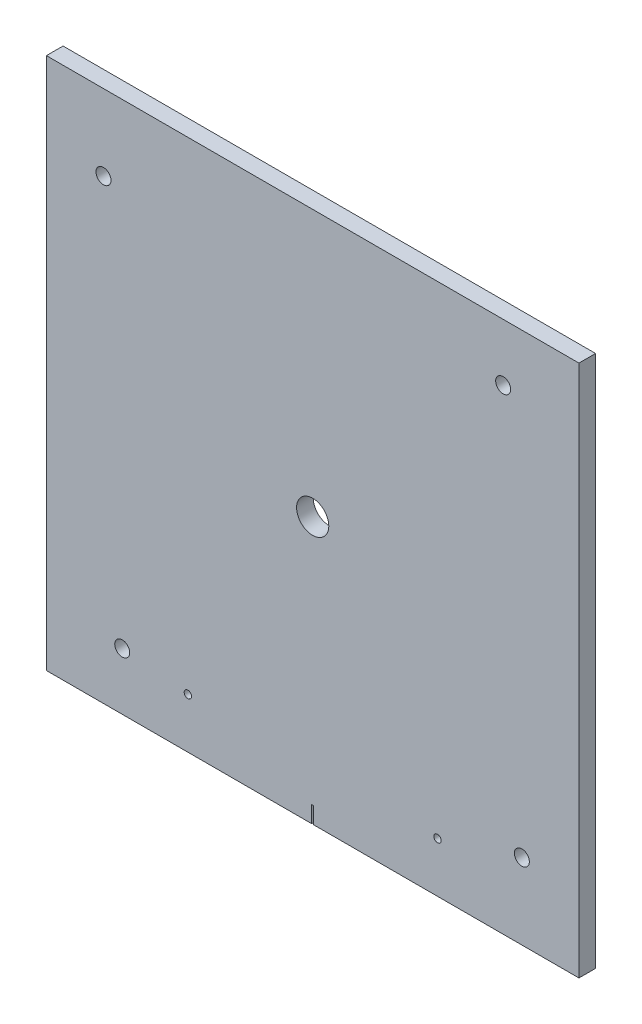
ISO-10303-21;
HEADER;
FILE_DESCRIPTION(('STEP AP214'),'2;1');
FILE_NAME('part.step','',(''),(''),'','','');
FILE_SCHEMA(('AUTOMOTIVE_DESIGN { 1 0 10303 214 1 1 1 1 }'));
ENDSEC;
DATA;
#1=APPLICATION_CONTEXT('core data for automotive mechanical design processes');
#2=APPLICATION_PROTOCOL_DEFINITION('international standard','automotive_design',2000,#1);
#3=PRODUCT_CONTEXT('',#1,'mechanical');
#4=PRODUCT('Part','Part','',(#3));
#5=PRODUCT_RELATED_PRODUCT_CATEGORY('part','',(#4));
#6=PRODUCT_DEFINITION_FORMATION('','',#4);
#7=PRODUCT_DEFINITION_CONTEXT('part definition',#1,'design');
#8=PRODUCT_DEFINITION('design','',#6,#7);
#9=PRODUCT_DEFINITION_SHAPE('','',#8);
#10=(LENGTH_UNIT() NAMED_UNIT(*) SI_UNIT(.MILLI.,.METRE.));
#11=(NAMED_UNIT(*) PLANE_ANGLE_UNIT() SI_UNIT($,.RADIAN.));
#12=(NAMED_UNIT(*) SI_UNIT($,.STERADIAN.) SOLID_ANGLE_UNIT());
#13=UNCERTAINTY_MEASURE_WITH_UNIT(LENGTH_MEASURE(1.E-05),#10,'distance_accuracy_value','');
#14=(GEOMETRIC_REPRESENTATION_CONTEXT(3) GLOBAL_UNCERTAINTY_ASSIGNED_CONTEXT((#13)) GLOBAL_UNIT_ASSIGNED_CONTEXT((#10,
#11,#12)) REPRESENTATION_CONTEXT('',''));
#15=CARTESIAN_POINT('',(0.,0.,0.));
#16=DIRECTION('',(0.,0.,1.));
#17=DIRECTION('',(1.,0.,0.));
#18=AXIS2_PLACEMENT_3D('',#15,#16,#17);
#19=CARTESIAN_POINT('',(-101.6,-101.6,6.35));
#20=DIRECTION('',(0.,1.,0.));
#21=DIRECTION('',(0.,0.,1.));
#22=AXIS2_PLACEMENT_3D('',#19,#20,#21);
#23=PLANE('',#22);
#24=DIRECTION('',(1.,0.,0.));
#25=VECTOR('',#24,1.);
#26=CARTESIAN_POINT('',(-101.6,-101.6,0.));
#27=LINE('',#26,#25);
#28=CARTESIAN_POINT('',(-101.6,-101.6,0.));
#29=VERTEX_POINT('',#28);
#30=CARTESIAN_POINT('',(-0.396875,-101.6,0.));
#31=VERTEX_POINT('',#30);
#32=EDGE_CURVE('E117',#29,#31,#27,.T.);
#33=ORIENTED_EDGE('',*,*,#32,.T.);
#34=DIRECTION('',(0.,0.,1.));
#35=VECTOR('',#34,1.);
#36=CARTESIAN_POINT('',(-0.396875,-101.6,0.));
#37=LINE('',#36,#35);
#38=CARTESIAN_POINT('',(-0.396875,-101.6,6.35));
#39=VERTEX_POINT('',#38);
#40=EDGE_CURVE('E105',#31,#39,#37,.T.);
#41=ORIENTED_EDGE('',*,*,#40,.T.);
#42=DIRECTION('',(1.,0.,0.));
#43=VECTOR('',#42,1.);
#44=CARTESIAN_POINT('',(-101.6,-101.6,6.35));
#45=LINE('',#44,#43);
#46=CARTESIAN_POINT('',(-101.6,-101.6,6.35));
#47=VERTEX_POINT('',#46);
#48=EDGE_CURVE('E83',#47,#39,#45,.T.);
#49=ORIENTED_EDGE('',*,*,#48,.F.);
#50=DIRECTION('',(0.,0.,-1.));
#51=VECTOR('',#50,1.);
#52=CARTESIAN_POINT('',(-101.6,-101.6,6.35));
#53=LINE('',#52,#51);
#54=EDGE_CURVE('E11',#47,#29,#53,.T.);
#55=ORIENTED_EDGE('',*,*,#54,.T.);
#56=EDGE_LOOP('',(#33,#41,#49,#55));
#57=FACE_BOUND('',#56,.T.);
#58=ADVANCED_FACE('F31',(#57),#23,.F.);
#59=CARTESIAN_POINT('',(-101.6,101.6,6.35));
#60=DIRECTION('',(1.,0.,0.));
#61=DIRECTION('',(0.,1.,0.));
#62=AXIS2_PLACEMENT_3D('',#59,#60,#61);
#63=PLANE('',#62);
#64=DIRECTION('',(0.,-1.,0.));
#65=VECTOR('',#64,1.);
#66=CARTESIAN_POINT('',(-101.6,101.6,0.));
#67=LINE('',#66,#65);
#68=CARTESIAN_POINT('',(-101.6,101.6,0.));
#69=VERTEX_POINT('',#68);
#70=EDGE_CURVE('E128',#69,#29,#67,.T.);
#71=ORIENTED_EDGE('',*,*,#70,.T.);
#72=ORIENTED_EDGE('',*,*,#54,.F.);
#73=DIRECTION('',(0.,-1.,0.));
#74=VECTOR('',#73,1.);
#75=CARTESIAN_POINT('',(-101.6,101.6,6.35));
#76=LINE('',#75,#74);
#77=CARTESIAN_POINT('',(-101.6,101.6,6.35));
#78=VERTEX_POINT('',#77);
#79=EDGE_CURVE('E133',#78,#47,#76,.T.);
#80=ORIENTED_EDGE('',*,*,#79,.F.);
#81=DIRECTION('',(0.,0.,-1.));
#82=VECTOR('',#81,1.);
#83=CARTESIAN_POINT('',(-101.6,101.6,6.35));
#84=LINE('',#83,#82);
#85=EDGE_CURVE('E134',#78,#69,#84,.T.);
#86=ORIENTED_EDGE('',*,*,#85,.T.);
#87=EDGE_LOOP('',(#71,#72,#80,#86));
#88=FACE_BOUND('',#87,.T.);
#89=ADVANCED_FACE('F33',(#88),#63,.F.);
#90=CARTESIAN_POINT('',(0.396875,-101.6,6.35));
#91=VERTEX_POINT('',#90);
#92=CARTESIAN_POINT('',(101.6,-101.6,6.35));
#93=VERTEX_POINT('',#92);
#94=EDGE_CURVE('E163',#91,#93,#45,.T.);
#95=ORIENTED_EDGE('',*,*,#94,.F.);
#96=DIRECTION('',(0.,0.,1.));
#97=VECTOR('',#96,1.);
#98=CARTESIAN_POINT('',(0.396875,-101.6,0.));
#99=LINE('',#98,#97);
#100=CARTESIAN_POINT('',(0.396875,-101.6,0.));
#101=VERTEX_POINT('',#100);
#102=EDGE_CURVE('E112',#101,#91,#99,.T.);
#103=ORIENTED_EDGE('',*,*,#102,.F.);
#104=CARTESIAN_POINT('',(101.6,-101.6,0.));
#105=VERTEX_POINT('',#104);
#106=EDGE_CURVE('E125',#101,#105,#27,.T.);
#107=ORIENTED_EDGE('',*,*,#106,.T.);
#108=DIRECTION('',(0.,0.,-1.));
#109=VECTOR('',#108,1.);
#110=CARTESIAN_POINT('',(101.6,-101.6,6.35));
#111=LINE('',#110,#109);
#112=EDGE_CURVE('E39',#93,#105,#111,.T.);
#113=ORIENTED_EDGE('',*,*,#112,.F.);
#114=EDGE_LOOP('',(#95,#103,#107,#113));
#115=FACE_BOUND('',#114,.T.);
#116=ADVANCED_FACE('F222',(#115),#23,.F.);
#117=CARTESIAN_POINT('',(101.6,101.6,6.35));
#118=DIRECTION('',(-1.,0.,0.));
#119=DIRECTION('',(0.,-1.,0.));
#120=AXIS2_PLACEMENT_3D('',#117,#118,#119);
#121=PLANE('',#120);
#122=DIRECTION('',(0.,1.,0.));
#123=VECTOR('',#122,1.);
#124=CARTESIAN_POINT('',(101.6,101.6,0.));
#125=LINE('',#124,#123);
#126=CARTESIAN_POINT('',(101.6,101.6,0.));
#127=VERTEX_POINT('',#126);
#128=EDGE_CURVE('E124',#105,#127,#125,.T.);
#129=ORIENTED_EDGE('',*,*,#128,.T.);
#130=DIRECTION('',(0.,0.,-1.));
#131=VECTOR('',#130,1.);
#132=CARTESIAN_POINT('',(101.6,101.6,6.35));
#133=LINE('',#132,#131);
#134=CARTESIAN_POINT('',(101.6,101.6,6.35));
#135=VERTEX_POINT('',#134);
#136=EDGE_CURVE('E136',#135,#127,#133,.T.);
#137=ORIENTED_EDGE('',*,*,#136,.F.);
#138=DIRECTION('',(0.,1.,0.));
#139=VECTOR('',#138,1.);
#140=CARTESIAN_POINT('',(101.6,101.6,6.35));
#141=LINE('',#140,#139);
#142=EDGE_CURVE('E144',#93,#135,#141,.T.);
#143=ORIENTED_EDGE('',*,*,#142,.F.);
#144=ORIENTED_EDGE('',*,*,#112,.T.);
#145=EDGE_LOOP('',(#129,#137,#143,#144));
#146=FACE_BOUND('',#145,.T.);
#147=ADVANCED_FACE('F142',(#146),#121,.F.);
#148=CARTESIAN_POINT('',(-101.6,101.6,6.35));
#149=DIRECTION('',(0.,-1.,0.));
#150=DIRECTION('',(0.,0.,-1.));
#151=AXIS2_PLACEMENT_3D('',#148,#149,#150);
#152=PLANE('',#151);
#153=DIRECTION('',(-1.,0.,0.));
#154=VECTOR('',#153,1.);
#155=CARTESIAN_POINT('',(-101.6,101.6,0.));
#156=LINE('',#155,#154);
#157=EDGE_CURVE('E76',#127,#69,#156,.T.);
#158=ORIENTED_EDGE('',*,*,#157,.T.);
#159=ORIENTED_EDGE('',*,*,#85,.F.);
#160=DIRECTION('',(-1.,0.,0.));
#161=VECTOR('',#160,1.);
#162=CARTESIAN_POINT('',(-101.6,101.6,6.35));
#163=LINE('',#162,#161);
#164=EDGE_CURVE('E55',#135,#78,#163,.T.);
#165=ORIENTED_EDGE('',*,*,#164,.F.);
#166=ORIENTED_EDGE('',*,*,#136,.T.);
#167=EDGE_LOOP('',(#158,#159,#165,#166));
#168=FACE_BOUND('',#167,.T.);
#169=ADVANCED_FACE('F168',(#168),#152,.F.);
#170=CARTESIAN_POINT('',(-101.6,-101.6,6.35));
#171=DIRECTION('',(0.,0.,1.));
#172=DIRECTION('',(1.,0.,0.));
#173=AXIS2_PLACEMENT_3D('',#170,#171,#172);
#174=PLANE('',#173);
#175=CARTESIAN_POINT('',(79.8229388799338,-72.6739356892851,6.35));
#176=DIRECTION('',(0.,0.,1.));
#177=DIRECTION('',(1.,0.,0.));
#178=AXIS2_PLACEMENT_3D('',#175,#176,#177);
#179=CIRCLE('',#178,2.8575);
#180=CARTESIAN_POINT('',(82.6804388799338,-72.6739356892851,6.35));
#181=VERTEX_POINT('',#180);
#182=EDGE_CURVE('E250',#181,#181,#179,.T.);
#183=ORIENTED_EDGE('',*,*,#182,.F.);
#184=EDGE_LOOP('',(#183));
#185=FACE_BOUND('',#184,.T.);
#186=CARTESIAN_POINT('',(-72.6739356892852,-79.8229388799338,6.35));
#187=DIRECTION('',(0.,0.,1.));
#188=DIRECTION('',(1.,0.,0.));
#189=AXIS2_PLACEMENT_3D('',#186,#187,#188);
#190=CIRCLE('',#189,2.8575);
#191=CARTESIAN_POINT('',(-69.8164356892852,-79.8229388799338,6.35));
#192=VERTEX_POINT('',#191);
#193=EDGE_CURVE('E244',#192,#192,#190,.T.);
#194=ORIENTED_EDGE('',*,*,#193,.F.);
#195=EDGE_LOOP('',(#194));
#196=FACE_BOUND('',#195,.T.);
#197=CARTESIAN_POINT('',(72.6739356892855,79.8229388799335,6.35));
#198=DIRECTION('',(0.,0.,1.));
#199=DIRECTION('',(1.,0.,0.));
#200=AXIS2_PLACEMENT_3D('',#197,#198,#199);
#201=CIRCLE('',#200,2.8575);
#202=CARTESIAN_POINT('',(75.5314356892855,79.8229388799335,6.35));
#203=VERTEX_POINT('',#202);
#204=EDGE_CURVE('E238',#203,#203,#201,.T.);
#205=ORIENTED_EDGE('',*,*,#204,.F.);
#206=EDGE_LOOP('',(#205));
#207=FACE_BOUND('',#206,.T.);
#208=CARTESIAN_POINT('',(-79.8229388799337,72.6739356892852,6.35));
#209=DIRECTION('',(0.,0.,1.));
#210=DIRECTION('',(1.,0.,0.));
#211=AXIS2_PLACEMENT_3D('',#208,#209,#210);
#212=CIRCLE('',#211,2.8575);
#213=CARTESIAN_POINT('',(-76.9654388799337,72.6739356892852,6.35));
#214=VERTEX_POINT('',#213);
#215=EDGE_CURVE('E178',#214,#214,#212,.T.);
#216=ORIENTED_EDGE('',*,*,#215,.F.);
#217=EDGE_LOOP('',(#216));
#218=FACE_BOUND('',#217,.T.);
#219=DIRECTION('',(0.,-1.,0.));
#220=VECTOR('',#219,1.);
#221=CARTESIAN_POINT('',(-0.396875,-95.25,6.35));
#222=LINE('',#221,#220);
#223=CARTESIAN_POINT('',(-0.396875,-95.25,6.35));
#224=VERTEX_POINT('',#223);
#225=EDGE_CURVE('E110',#224,#39,#222,.T.);
#226=ORIENTED_EDGE('',*,*,#225,.F.);
#227=DIRECTION('',(-1.,0.,0.));
#228=VECTOR('',#227,1.);
#229=CARTESIAN_POINT('',(-0.396875,-95.25,6.35));
#230=LINE('',#229,#228);
#231=CARTESIAN_POINT('',(0.396875,-95.25,6.35));
#232=VERTEX_POINT('',#231);
#233=EDGE_CURVE('E120',#232,#224,#230,.T.);
#234=ORIENTED_EDGE('',*,*,#233,.F.);
#235=DIRECTION('',(0.,1.,0.));
#236=VECTOR('',#235,1.);
#237=CARTESIAN_POINT('',(0.396875,-101.6,6.35));
#238=LINE('',#237,#236);
#239=EDGE_CURVE('E172',#91,#232,#238,.T.);
#240=ORIENTED_EDGE('',*,*,#239,.F.);
#241=ORIENTED_EDGE('',*,*,#94,.T.);
#242=ORIENTED_EDGE('',*,*,#142,.T.);
#243=ORIENTED_EDGE('',*,*,#164,.T.);
#244=ORIENTED_EDGE('',*,*,#79,.T.);
#245=ORIENTED_EDGE('',*,*,#48,.T.);
#246=EDGE_LOOP('',(#226,#234,#240,#241,#242,#243,#244,#245));
#247=FACE_BOUND('',#246,.T.);
#248=CARTESIAN_POINT('',(47.6250000000002,-82.4889197104677,6.35));
#249=DIRECTION('',(0.,0.,1.));
#250=DIRECTION('',(1.,0.,0.));
#251=AXIS2_PLACEMENT_3D('',#248,#249,#250);
#252=CIRCLE('',#251,1.4097);
#253=CARTESIAN_POINT('',(49.0347000000002,-82.4889197104677,6.35));
#254=VERTEX_POINT('',#253);
#255=EDGE_CURVE('E186',#254,#254,#252,.T.);
#256=ORIENTED_EDGE('',*,*,#255,.F.);
#257=EDGE_LOOP('',(#256));
#258=FACE_BOUND('',#257,.T.);
#259=CARTESIAN_POINT('',(-47.625,-82.4889197104678,6.35));
#260=DIRECTION('',(0.,0.,1.));
#261=DIRECTION('',(1.,0.,0.));
#262=AXIS2_PLACEMENT_3D('',#259,#260,#261);
#263=CIRCLE('',#262,1.4097);
#264=CARTESIAN_POINT('',(-46.2153,-82.4889197104678,6.35));
#265=VERTEX_POINT('',#264);
#266=EDGE_CURVE('E159',#265,#265,#263,.T.);
#267=ORIENTED_EDGE('',*,*,#266,.F.);
#268=EDGE_LOOP('',(#267));
#269=FACE_BOUND('',#268,.T.);
#270=CARTESIAN_POINT('',(0.,0.,6.35));
#271=DIRECTION('',(0.,0.,1.));
#272=DIRECTION('',(1.,0.,0.));
#273=AXIS2_PLACEMENT_3D('',#270,#271,#272);
#274=CIRCLE('',#273,6.1468);
#275=CARTESIAN_POINT('',(6.1468,0.,6.35));
#276=VERTEX_POINT('',#275);
#277=EDGE_CURVE('E151',#276,#276,#274,.T.);
#278=ORIENTED_EDGE('',*,*,#277,.F.);
#279=EDGE_LOOP('',(#278));
#280=FACE_BOUND('',#279,.T.);
#281=ADVANCED_FACE('F165',(#185,#196,#207,#218,#247,#258,#269,#280),#174,.T.);
#282=CARTESIAN_POINT('',(-101.6,-101.6,0.));
#283=DIRECTION('',(0.,0.,1.));
#284=DIRECTION('',(1.,0.,0.));
#285=AXIS2_PLACEMENT_3D('',#282,#283,#284);
#286=PLANE('',#285);
#287=CARTESIAN_POINT('',(79.8229388799338,-72.6739356892851,0.));
#288=DIRECTION('',(0.,0.,1.));
#289=DIRECTION('',(1.,0.,0.));
#290=AXIS2_PLACEMENT_3D('',#287,#288,#289);
#291=CIRCLE('',#290,2.8575);
#292=CARTESIAN_POINT('',(82.6804388799338,-72.6739356892851,0.));
#293=VERTEX_POINT('',#292);
#294=EDGE_CURVE('E247',#293,#293,#291,.T.);
#295=ORIENTED_EDGE('',*,*,#294,.T.);
#296=EDGE_LOOP('',(#295));
#297=FACE_BOUND('',#296,.T.);
#298=CARTESIAN_POINT('',(-72.6739356892852,-79.8229388799338,0.));
#299=DIRECTION('',(0.,0.,1.));
#300=DIRECTION('',(1.,0.,0.));
#301=AXIS2_PLACEMENT_3D('',#298,#299,#300);
#302=CIRCLE('',#301,2.8575);
#303=CARTESIAN_POINT('',(-69.8164356892852,-79.8229388799338,0.));
#304=VERTEX_POINT('',#303);
#305=EDGE_CURVE('E241',#304,#304,#302,.T.);
#306=ORIENTED_EDGE('',*,*,#305,.T.);
#307=EDGE_LOOP('',(#306));
#308=FACE_BOUND('',#307,.T.);
#309=CARTESIAN_POINT('',(72.6739356892855,79.8229388799335,0.));
#310=DIRECTION('',(0.,0.,1.));
#311=DIRECTION('',(1.,0.,0.));
#312=AXIS2_PLACEMENT_3D('',#309,#310,#311);
#313=CIRCLE('',#312,2.8575);
#314=CARTESIAN_POINT('',(75.5314356892855,79.8229388799335,0.));
#315=VERTEX_POINT('',#314);
#316=EDGE_CURVE('E236',#315,#315,#313,.T.);
#317=ORIENTED_EDGE('',*,*,#316,.T.);
#318=EDGE_LOOP('',(#317));
#319=FACE_BOUND('',#318,.T.);
#320=CARTESIAN_POINT('',(-79.8229388799337,72.6739356892852,0.));
#321=DIRECTION('',(0.,0.,1.));
#322=DIRECTION('',(1.,0.,0.));
#323=AXIS2_PLACEMENT_3D('',#320,#321,#322);
#324=CIRCLE('',#323,2.8575);
#325=CARTESIAN_POINT('',(-76.9654388799337,72.6739356892852,0.));
#326=VERTEX_POINT('',#325);
#327=EDGE_CURVE('E173',#326,#326,#324,.T.);
#328=ORIENTED_EDGE('',*,*,#327,.T.);
#329=EDGE_LOOP('',(#328));
#330=FACE_BOUND('',#329,.T.);
#331=CARTESIAN_POINT('',(47.6250000000002,-82.4889197104677,0.));
#332=DIRECTION('',(0.,0.,1.));
#333=DIRECTION('',(1.,0.,0.));
#334=AXIS2_PLACEMENT_3D('',#331,#332,#333);
#335=CIRCLE('',#334,1.4097);
#336=CARTESIAN_POINT('',(49.0347000000002,-82.4889197104677,0.));
#337=VERTEX_POINT('',#336);
#338=EDGE_CURVE('E190',#337,#337,#335,.T.);
#339=ORIENTED_EDGE('',*,*,#338,.T.);
#340=EDGE_LOOP('',(#339));
#341=FACE_BOUND('',#340,.T.);
#342=CARTESIAN_POINT('',(-47.625,-82.4889197104678,0.));
#343=DIRECTION('',(0.,0.,1.));
#344=DIRECTION('',(1.,0.,0.));
#345=AXIS2_PLACEMENT_3D('',#342,#343,#344);
#346=CIRCLE('',#345,1.4097);
#347=CARTESIAN_POINT('',(-46.2153,-82.4889197104678,0.));
#348=VERTEX_POINT('',#347);
#349=EDGE_CURVE('E156',#348,#348,#346,.T.);
#350=ORIENTED_EDGE('',*,*,#349,.T.);
#351=EDGE_LOOP('',(#350));
#352=FACE_BOUND('',#351,.T.);
#353=CARTESIAN_POINT('',(0.,0.,0.));
#354=DIRECTION('',(0.,0.,1.));
#355=DIRECTION('',(1.,0.,0.));
#356=AXIS2_PLACEMENT_3D('',#353,#354,#355);
#357=CIRCLE('',#356,6.1468);
#358=CARTESIAN_POINT('',(6.1468,0.,0.));
#359=VERTEX_POINT('',#358);
#360=EDGE_CURVE('E149',#359,#359,#357,.T.);
#361=ORIENTED_EDGE('',*,*,#360,.T.);
#362=EDGE_LOOP('',(#361));
#363=FACE_BOUND('',#362,.T.);
#364=DIRECTION('',(-1.,0.,0.));
#365=VECTOR('',#364,1.);
#366=CARTESIAN_POINT('',(-0.396875,-95.25,0.));
#367=LINE('',#366,#365);
#368=CARTESIAN_POINT('',(0.396875000000005,-95.25,0.));
#369=VERTEX_POINT('',#368);
#370=CARTESIAN_POINT('',(-0.396875,-95.25,0.));
#371=VERTEX_POINT('',#370);
#372=EDGE_CURVE('E46',#369,#371,#367,.T.);
#373=ORIENTED_EDGE('',*,*,#372,.T.);
#374=DIRECTION('',(0.,-1.,0.));
#375=VECTOR('',#374,1.);
#376=CARTESIAN_POINT('',(-0.396875,-95.25,0.));
#377=LINE('',#376,#375);
#378=EDGE_CURVE('E108',#371,#31,#377,.T.);
#379=ORIENTED_EDGE('',*,*,#378,.T.);
#380=ORIENTED_EDGE('',*,*,#32,.F.);
#381=ORIENTED_EDGE('',*,*,#70,.F.);
#382=ORIENTED_EDGE('',*,*,#157,.F.);
#383=ORIENTED_EDGE('',*,*,#128,.F.);
#384=ORIENTED_EDGE('',*,*,#106,.F.);
#385=DIRECTION('',(0.,1.,0.));
#386=VECTOR('',#385,1.);
#387=CARTESIAN_POINT('',(0.396875,-101.6,0.));
#388=LINE('',#387,#386);
#389=EDGE_CURVE('E119',#101,#369,#388,.T.);
#390=ORIENTED_EDGE('',*,*,#389,.T.);
#391=EDGE_LOOP('',(#373,#379,#380,#381,#382,#383,#384,#390));
#392=FACE_BOUND('',#391,.T.);
#393=ADVANCED_FACE('F115',(#297,#308,#319,#330,#341,#352,#363,#392),#286,.F.);
#394=CARTESIAN_POINT('',(0.,0.,0.));
#395=DIRECTION('',(0.,0.,1.));
#396=DIRECTION('',(1.,0.,0.));
#397=AXIS2_PLACEMENT_3D('',#394,#395,#396);
#398=CYLINDRICAL_SURFACE('',#397,6.1468);
#399=ORIENTED_EDGE('',*,*,#360,.F.);
#400=EDGE_LOOP('',(#399));
#401=FACE_BOUND('',#400,.T.);
#402=ORIENTED_EDGE('',*,*,#277,.T.);
#403=EDGE_LOOP('',(#402));
#404=FACE_BOUND('',#403,.T.);
#405=ADVANCED_FACE('F208',(#401,#404),#398,.F.);
#406=CARTESIAN_POINT('',(-47.625,-82.4889197104678,0.));
#407=DIRECTION('',(0.,0.,1.));
#408=DIRECTION('',(1.,0.,0.));
#409=AXIS2_PLACEMENT_3D('',#406,#407,#408);
#410=CYLINDRICAL_SURFACE('',#409,1.4097);
#411=ORIENTED_EDGE('',*,*,#349,.F.);
#412=EDGE_LOOP('',(#411));
#413=FACE_BOUND('',#412,.T.);
#414=ORIENTED_EDGE('',*,*,#266,.T.);
#415=EDGE_LOOP('',(#414));
#416=FACE_BOUND('',#415,.T.);
#417=ADVANCED_FACE('F200',(#413,#416),#410,.F.);
#418=CARTESIAN_POINT('',(47.6250000000002,-82.4889197104677,0.));
#419=DIRECTION('',(0.,0.,1.));
#420=DIRECTION('',(1.,0.,0.));
#421=AXIS2_PLACEMENT_3D('',#418,#419,#420);
#422=CYLINDRICAL_SURFACE('',#421,1.4097);
#423=ORIENTED_EDGE('',*,*,#338,.F.);
#424=EDGE_LOOP('',(#423));
#425=FACE_BOUND('',#424,.T.);
#426=ORIENTED_EDGE('',*,*,#255,.T.);
#427=EDGE_LOOP('',(#426));
#428=FACE_BOUND('',#427,.T.);
#429=ADVANCED_FACE('F216',(#425,#428),#422,.F.);
#430=CARTESIAN_POINT('',(-0.396875,-95.25,0.));
#431=DIRECTION('',(-1.,0.,0.));
#432=DIRECTION('',(0.,0.,1.));
#433=AXIS2_PLACEMENT_3D('',#430,#431,#432);
#434=PLANE('',#433);
#435=ORIENTED_EDGE('',*,*,#225,.T.);
#436=ORIENTED_EDGE('',*,*,#40,.F.);
#437=ORIENTED_EDGE('',*,*,#378,.F.);
#438=DIRECTION('',(0.,0.,1.));
#439=VECTOR('',#438,1.);
#440=CARTESIAN_POINT('',(-0.396875,-95.25,0.));
#441=LINE('',#440,#439);
#442=EDGE_CURVE('E184',#371,#224,#441,.T.);
#443=ORIENTED_EDGE('',*,*,#442,.T.);
#444=EDGE_LOOP('',(#435,#436,#437,#443));
#445=FACE_BOUND('',#444,.T.);
#446=ADVANCED_FACE('F107',(#445),#434,.F.);
#447=CARTESIAN_POINT('',(-0.396875,-95.25,0.));
#448=DIRECTION('',(0.,1.,0.));
#449=DIRECTION('',(0.,0.,1.));
#450=AXIS2_PLACEMENT_3D('',#447,#448,#449);
#451=PLANE('',#450);
#452=ORIENTED_EDGE('',*,*,#233,.T.);
#453=ORIENTED_EDGE('',*,*,#442,.F.);
#454=ORIENTED_EDGE('',*,*,#372,.F.);
#455=DIRECTION('',(0.,0.,1.));
#456=VECTOR('',#455,1.);
#457=CARTESIAN_POINT('',(0.396875,-95.25,0.));
#458=LINE('',#457,#456);
#459=EDGE_CURVE('E187',#369,#232,#458,.T.);
#460=ORIENTED_EDGE('',*,*,#459,.T.);
#461=EDGE_LOOP('',(#452,#453,#454,#460));
#462=FACE_BOUND('',#461,.T.);
#463=ADVANCED_FACE('F281',(#462),#451,.F.);
#464=CARTESIAN_POINT('',(0.396875,-101.6,0.));
#465=DIRECTION('',(1.,0.,0.));
#466=DIRECTION('',(0.,0.,-1.));
#467=AXIS2_PLACEMENT_3D('',#464,#465,#466);
#468=PLANE('',#467);
#469=ORIENTED_EDGE('',*,*,#239,.T.);
#470=ORIENTED_EDGE('',*,*,#459,.F.);
#471=ORIENTED_EDGE('',*,*,#389,.F.);
#472=ORIENTED_EDGE('',*,*,#102,.T.);
#473=EDGE_LOOP('',(#469,#470,#471,#472));
#474=FACE_BOUND('',#473,.T.);
#475=ADVANCED_FACE('F233',(#474),#468,.F.);
#476=CARTESIAN_POINT('',(-79.8229388799337,72.6739356892852,0.));
#477=DIRECTION('',(0.,0.,1.));
#478=DIRECTION('',(1.,0.,0.));
#479=AXIS2_PLACEMENT_3D('',#476,#477,#478);
#480=CYLINDRICAL_SURFACE('',#479,2.8575);
#481=ORIENTED_EDGE('',*,*,#327,.F.);
#482=EDGE_LOOP('',(#481));
#483=FACE_BOUND('',#482,.T.);
#484=ORIENTED_EDGE('',*,*,#215,.T.);
#485=EDGE_LOOP('',(#484));
#486=FACE_BOUND('',#485,.T.);
#487=ADVANCED_FACE('F270',(#483,#486),#480,.F.);
#488=CARTESIAN_POINT('',(72.6739356892855,79.8229388799335,0.));
#489=DIRECTION('',(0.,0.,1.));
#490=DIRECTION('',(1.,0.,0.));
#491=AXIS2_PLACEMENT_3D('',#488,#489,#490);
#492=CYLINDRICAL_SURFACE('',#491,2.8575);
#493=ORIENTED_EDGE('',*,*,#316,.F.);
#494=EDGE_LOOP('',(#493));
#495=FACE_BOUND('',#494,.T.);
#496=ORIENTED_EDGE('',*,*,#204,.T.);
#497=EDGE_LOOP('',(#496));
#498=FACE_BOUND('',#497,.T.);
#499=ADVANCED_FACE('F272',(#495,#498),#492,.F.);
#500=CARTESIAN_POINT('',(-72.6739356892852,-79.8229388799338,0.));
#501=DIRECTION('',(0.,0.,1.));
#502=DIRECTION('',(1.,0.,0.));
#503=AXIS2_PLACEMENT_3D('',#500,#501,#502);
#504=CYLINDRICAL_SURFACE('',#503,2.8575);
#505=ORIENTED_EDGE('',*,*,#305,.F.);
#506=EDGE_LOOP('',(#505));
#507=FACE_BOUND('',#506,.T.);
#508=ORIENTED_EDGE('',*,*,#193,.T.);
#509=EDGE_LOOP('',(#508));
#510=FACE_BOUND('',#509,.T.);
#511=ADVANCED_FACE('F260',(#507,#510),#504,.F.);
#512=CARTESIAN_POINT('',(79.8229388799338,-72.6739356892851,0.));
#513=DIRECTION('',(0.,0.,1.));
#514=DIRECTION('',(1.,0.,0.));
#515=AXIS2_PLACEMENT_3D('',#512,#513,#514);
#516=CYLINDRICAL_SURFACE('',#515,2.8575);
#517=ORIENTED_EDGE('',*,*,#294,.F.);
#518=EDGE_LOOP('',(#517));
#519=FACE_BOUND('',#518,.T.);
#520=ORIENTED_EDGE('',*,*,#182,.T.);
#521=EDGE_LOOP('',(#520));
#522=FACE_BOUND('',#521,.T.);
#523=ADVANCED_FACE('F257',(#519,#522),#516,.F.);
#524=CLOSED_SHELL('',(#58,#89,#116,#147,#169,#281,#393,#405,#417,#429,#446,#463,#475,#487,#499,
#511,#523));
#525=MANIFOLD_SOLID_BREP('B2',#524);
#526=ADVANCED_BREP_SHAPE_REPRESENTATION('',(#18,#525),#14);
#527=SHAPE_DEFINITION_REPRESENTATION(#9,#526);
ENDSEC;
END-ISO-10303-21;
